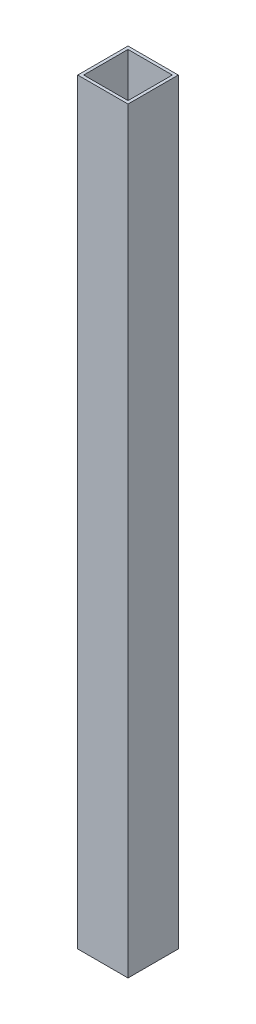
ISO-10303-21;
HEADER;
FILE_DESCRIPTION(('STEP AP214'),'2;1');
FILE_NAME('part.step','',(''),(''),'','','');
FILE_SCHEMA(('AUTOMOTIVE_DESIGN { 1 0 10303 214 1 1 1 1 }'));
ENDSEC;
DATA;
#1=APPLICATION_CONTEXT('core data for automotive mechanical design processes');
#2=APPLICATION_PROTOCOL_DEFINITION('international standard','automotive_design',2000,#1);
#3=PRODUCT_CONTEXT('',#1,'mechanical');
#4=PRODUCT('Part','Part','',(#3));
#5=PRODUCT_RELATED_PRODUCT_CATEGORY('part','',(#4));
#6=PRODUCT_DEFINITION_FORMATION('','',#4);
#7=PRODUCT_DEFINITION_CONTEXT('part definition',#1,'design');
#8=PRODUCT_DEFINITION('design','',#6,#7);
#9=PRODUCT_DEFINITION_SHAPE('','',#8);
#10=(LENGTH_UNIT() NAMED_UNIT(*) SI_UNIT(.MILLI.,.METRE.));
#11=(NAMED_UNIT(*) PLANE_ANGLE_UNIT() SI_UNIT($,.RADIAN.));
#12=(NAMED_UNIT(*) SI_UNIT($,.STERADIAN.) SOLID_ANGLE_UNIT());
#13=UNCERTAINTY_MEASURE_WITH_UNIT(LENGTH_MEASURE(1.E-05),#10,'distance_accuracy_value','');
#14=(GEOMETRIC_REPRESENTATION_CONTEXT(3) GLOBAL_UNCERTAINTY_ASSIGNED_CONTEXT((#13)) GLOBAL_UNIT_ASSIGNED_CONTEXT((#10,
#11,#12)) REPRESENTATION_CONTEXT('',''));
#15=CARTESIAN_POINT('',(0.,0.,0.));
#16=DIRECTION('',(0.,0.,1.));
#17=DIRECTION('',(1.,0.,0.));
#18=AXIS2_PLACEMENT_3D('',#15,#16,#17);
#19=CARTESIAN_POINT('',(-8.5,256.,-8.5));
#20=DIRECTION('',(0.,0.,-1.));
#21=DIRECTION('',(-1.,0.,0.));
#22=AXIS2_PLACEMENT_3D('',#19,#20,#21);
#23=PLANE('',#22);
#24=DIRECTION('',(1.,0.,0.));
#25=VECTOR('',#24,1.);
#26=CARTESIAN_POINT('',(-8.5,0.,-8.5));
#27=LINE('',#26,#25);
#28=CARTESIAN_POINT('',(-8.5,0.,-8.5));
#29=VERTEX_POINT('',#28);
#30=CARTESIAN_POINT('',(8.49999999999999,0.,-8.5));
#31=VERTEX_POINT('',#30);
#32=EDGE_CURVE('E170',#29,#31,#27,.T.);
#33=ORIENTED_EDGE('',*,*,#32,.F.);
#34=DIRECTION('',(0.,-1.,0.));
#35=VECTOR('',#34,1.);
#36=CARTESIAN_POINT('',(-8.5,256.,-8.5));
#37=LINE('',#36,#35);
#38=CARTESIAN_POINT('',(-8.5,256.,-8.5));
#39=VERTEX_POINT('',#38);
#40=EDGE_CURVE('E12',#39,#29,#37,.T.);
#41=ORIENTED_EDGE('',*,*,#40,.F.);
#42=DIRECTION('',(1.,0.,0.));
#43=VECTOR('',#42,1.);
#44=CARTESIAN_POINT('',(-8.5,256.,-8.5));
#45=LINE('',#44,#43);
#46=CARTESIAN_POINT('',(8.49999999999999,256.,-8.5));
#47=VERTEX_POINT('',#46);
#48=EDGE_CURVE('E176',#39,#47,#45,.T.);
#49=ORIENTED_EDGE('',*,*,#48,.T.);
#50=DIRECTION('',(0.,-1.,0.));
#51=VECTOR('',#50,1.);
#52=CARTESIAN_POINT('',(8.49999999999999,256.,-8.5));
#53=LINE('',#52,#51);
#54=EDGE_CURVE('E66',#47,#31,#53,.T.);
#55=ORIENTED_EDGE('',*,*,#54,.T.);
#56=EDGE_LOOP('',(#33,#41,#49,#55));
#57=FACE_BOUND('',#56,.T.);
#58=ADVANCED_FACE('F63',(#57),#23,.T.);
#59=CARTESIAN_POINT('',(-8.5,256.,-8.5));
#60=DIRECTION('',(1.,0.,0.));
#61=DIRECTION('',(0.,0.,-1.));
#62=AXIS2_PLACEMENT_3D('',#59,#60,#61);
#63=PLANE('',#62);
#64=DIRECTION('',(0.,0.,1.));
#65=VECTOR('',#64,1.);
#66=CARTESIAN_POINT('',(-8.5,0.,-8.5));
#67=LINE('',#66,#65);
#68=CARTESIAN_POINT('',(-8.5,0.,8.5));
#69=VERTEX_POINT('',#68);
#70=EDGE_CURVE('E181',#29,#69,#67,.T.);
#71=ORIENTED_EDGE('',*,*,#70,.T.);
#72=DIRECTION('',(0.,-1.,0.));
#73=VECTOR('',#72,1.);
#74=CARTESIAN_POINT('',(-8.5,256.,8.5));
#75=LINE('',#74,#73);
#76=CARTESIAN_POINT('',(-8.5,256.,8.5));
#77=VERTEX_POINT('',#76);
#78=EDGE_CURVE('E72',#77,#69,#75,.T.);
#79=ORIENTED_EDGE('',*,*,#78,.F.);
#80=DIRECTION('',(0.,0.,1.));
#81=VECTOR('',#80,1.);
#82=CARTESIAN_POINT('',(-8.5,256.,-8.5));
#83=LINE('',#82,#81);
#84=EDGE_CURVE('E188',#39,#77,#83,.T.);
#85=ORIENTED_EDGE('',*,*,#84,.F.);
#86=ORIENTED_EDGE('',*,*,#40,.T.);
#87=EDGE_LOOP('',(#71,#79,#85,#86));
#88=FACE_BOUND('',#87,.T.);
#89=ADVANCED_FACE('F223',(#88),#63,.F.);
#90=CARTESIAN_POINT('',(-8.5,256.,8.5));
#91=DIRECTION('',(0.,0.,-1.));
#92=DIRECTION('',(-1.,0.,0.));
#93=AXIS2_PLACEMENT_3D('',#90,#91,#92);
#94=PLANE('',#93);
#95=DIRECTION('',(1.,0.,0.));
#96=VECTOR('',#95,1.);
#97=CARTESIAN_POINT('',(-8.5,0.,8.5));
#98=LINE('',#97,#96);
#99=CARTESIAN_POINT('',(8.49999999999999,0.,8.5));
#100=VERTEX_POINT('',#99);
#101=EDGE_CURVE('E198',#69,#100,#98,.T.);
#102=ORIENTED_EDGE('',*,*,#101,.T.);
#103=DIRECTION('',(0.,-1.,0.));
#104=VECTOR('',#103,1.);
#105=CARTESIAN_POINT('',(8.49999999999999,256.,8.5));
#106=LINE('',#105,#104);
#107=CARTESIAN_POINT('',(8.49999999999999,256.,8.5));
#108=VERTEX_POINT('',#107);
#109=EDGE_CURVE('E206',#108,#100,#106,.T.);
#110=ORIENTED_EDGE('',*,*,#109,.F.);
#111=DIRECTION('',(1.,0.,0.));
#112=VECTOR('',#111,1.);
#113=CARTESIAN_POINT('',(-8.5,256.,8.5));
#114=LINE('',#113,#112);
#115=EDGE_CURVE('E185',#77,#108,#114,.T.);
#116=ORIENTED_EDGE('',*,*,#115,.F.);
#117=ORIENTED_EDGE('',*,*,#78,.T.);
#118=EDGE_LOOP('',(#102,#110,#116,#117));
#119=FACE_BOUND('',#118,.T.);
#120=ADVANCED_FACE('F227',(#119),#94,.F.);
#121=CARTESIAN_POINT('',(8.49999999999999,256.,-8.5));
#122=DIRECTION('',(1.,0.,0.));
#123=DIRECTION('',(0.,0.,-1.));
#124=AXIS2_PLACEMENT_3D('',#121,#122,#123);
#125=PLANE('',#124);
#126=DIRECTION('',(0.,0.,1.));
#127=VECTOR('',#126,1.);
#128=CARTESIAN_POINT('',(8.49999999999999,0.,-8.5));
#129=LINE('',#128,#127);
#130=EDGE_CURVE('E194',#31,#100,#129,.T.);
#131=ORIENTED_EDGE('',*,*,#130,.F.);
#132=ORIENTED_EDGE('',*,*,#54,.F.);
#133=DIRECTION('',(0.,0.,1.));
#134=VECTOR('',#133,1.);
#135=CARTESIAN_POINT('',(8.49999999999999,256.,-8.5));
#136=LINE('',#135,#134);
#137=EDGE_CURVE('E180',#47,#108,#136,.T.);
#138=ORIENTED_EDGE('',*,*,#137,.T.);
#139=ORIENTED_EDGE('',*,*,#109,.T.);
#140=EDGE_LOOP('',(#131,#132,#138,#139));
#141=FACE_BOUND('',#140,.T.);
#142=ADVANCED_FACE('F216',(#141),#125,.T.);
#143=CARTESIAN_POINT('',(0.,256.,0.));
#144=DIRECTION('',(0.,-1.,0.));
#145=DIRECTION('',(0.,0.,-1.));
#146=AXIS2_PLACEMENT_3D('',#143,#144,#145);
#147=PLANE('',#146);
#148=DIRECTION('',(0.,0.,1.));
#149=VECTOR('',#148,1.);
#150=CARTESIAN_POINT('',(-7.5,256.,-7.5));
#151=LINE('',#150,#149);
#152=CARTESIAN_POINT('',(-7.5,256.,-7.5));
#153=VERTEX_POINT('',#152);
#154=CARTESIAN_POINT('',(-7.5,256.,7.5));
#155=VERTEX_POINT('',#154);
#156=EDGE_CURVE('E135',#153,#155,#151,.T.);
#157=ORIENTED_EDGE('',*,*,#156,.F.);
#158=DIRECTION('',(1.,0.,0.));
#159=VECTOR('',#158,1.);
#160=CARTESIAN_POINT('',(-7.5,256.,-7.5));
#161=LINE('',#160,#159);
#162=CARTESIAN_POINT('',(7.5,256.,-7.5));
#163=VERTEX_POINT('',#162);
#164=EDGE_CURVE('E131',#153,#163,#161,.T.);
#165=ORIENTED_EDGE('',*,*,#164,.T.);
#166=DIRECTION('',(0.,0.,1.));
#167=VECTOR('',#166,1.);
#168=CARTESIAN_POINT('',(7.5,256.,-7.5));
#169=LINE('',#168,#167);
#170=CARTESIAN_POINT('',(7.5,256.,7.5));
#171=VERTEX_POINT('',#170);
#172=EDGE_CURVE('E138',#163,#171,#169,.T.);
#173=ORIENTED_EDGE('',*,*,#172,.T.);
#174=DIRECTION('',(1.,0.,0.));
#175=VECTOR('',#174,1.);
#176=CARTESIAN_POINT('',(-7.5,256.,7.5));
#177=LINE('',#176,#175);
#178=EDGE_CURVE('E143',#155,#171,#177,.T.);
#179=ORIENTED_EDGE('',*,*,#178,.F.);
#180=EDGE_LOOP('',(#157,#165,#173,#179));
#181=FACE_BOUND('',#180,.T.);
#182=ORIENTED_EDGE('',*,*,#48,.F.);
#183=ORIENTED_EDGE('',*,*,#84,.T.);
#184=ORIENTED_EDGE('',*,*,#115,.T.);
#185=ORIENTED_EDGE('',*,*,#137,.F.);
#186=EDGE_LOOP('',(#182,#183,#184,#185));
#187=FACE_BOUND('',#186,.T.);
#188=ADVANCED_FACE('F145',(#181,#187),#147,.F.);
#189=CARTESIAN_POINT('',(0.,0.,0.));
#190=DIRECTION('',(0.,-1.,0.));
#191=DIRECTION('',(0.,0.,-1.));
#192=AXIS2_PLACEMENT_3D('',#189,#190,#191);
#193=PLANE('',#192);
#194=DIRECTION('',(1.,0.,0.));
#195=VECTOR('',#194,1.);
#196=CARTESIAN_POINT('',(-7.5,0.,-7.5));
#197=LINE('',#196,#195);
#198=CARTESIAN_POINT('',(-7.5,0.,-7.5));
#199=VERTEX_POINT('',#198);
#200=CARTESIAN_POINT('',(7.5,0.,-7.5));
#201=VERTEX_POINT('',#200);
#202=EDGE_CURVE('E88',#199,#201,#197,.T.);
#203=ORIENTED_EDGE('',*,*,#202,.F.);
#204=DIRECTION('',(0.,0.,1.));
#205=VECTOR('',#204,1.);
#206=CARTESIAN_POINT('',(-7.5,0.,-7.5));
#207=LINE('',#206,#205);
#208=CARTESIAN_POINT('',(-7.5,0.,7.5));
#209=VERTEX_POINT('',#208);
#210=EDGE_CURVE('E148',#199,#209,#207,.T.);
#211=ORIENTED_EDGE('',*,*,#210,.T.);
#212=DIRECTION('',(1.,0.,0.));
#213=VECTOR('',#212,1.);
#214=CARTESIAN_POINT('',(-7.5,0.,7.5));
#215=LINE('',#214,#213);
#216=CARTESIAN_POINT('',(7.5,0.,7.5));
#217=VERTEX_POINT('',#216);
#218=EDGE_CURVE('E152',#209,#217,#215,.T.);
#219=ORIENTED_EDGE('',*,*,#218,.T.);
#220=DIRECTION('',(0.,0.,1.));
#221=VECTOR('',#220,1.);
#222=CARTESIAN_POINT('',(7.5,0.,-7.5));
#223=LINE('',#222,#221);
#224=EDGE_CURVE('E161',#201,#217,#223,.T.);
#225=ORIENTED_EDGE('',*,*,#224,.F.);
#226=EDGE_LOOP('',(#203,#211,#219,#225));
#227=FACE_BOUND('',#226,.T.);
#228=ORIENTED_EDGE('',*,*,#32,.T.);
#229=ORIENTED_EDGE('',*,*,#130,.T.);
#230=ORIENTED_EDGE('',*,*,#101,.F.);
#231=ORIENTED_EDGE('',*,*,#70,.F.);
#232=EDGE_LOOP('',(#228,#229,#230,#231));
#233=FACE_BOUND('',#232,.T.);
#234=ADVANCED_FACE('F220',(#227,#233),#193,.T.);
#235=CARTESIAN_POINT('',(-7.5,256.,-7.5));
#236=DIRECTION('',(0.,0.,-1.));
#237=DIRECTION('',(-1.,0.,0.));
#238=AXIS2_PLACEMENT_3D('',#235,#236,#237);
#239=PLANE('',#238);
#240=ORIENTED_EDGE('',*,*,#202,.T.);
#241=DIRECTION('',(0.,-1.,0.));
#242=VECTOR('',#241,1.);
#243=CARTESIAN_POINT('',(7.5,256.,-7.5));
#244=LINE('',#243,#242);
#245=EDGE_CURVE('E128',#163,#201,#244,.T.);
#246=ORIENTED_EDGE('',*,*,#245,.F.);
#247=ORIENTED_EDGE('',*,*,#164,.F.);
#248=DIRECTION('',(0.,-1.,0.));
#249=VECTOR('',#248,1.);
#250=CARTESIAN_POINT('',(-7.5,256.,-7.5));
#251=LINE('',#250,#249);
#252=EDGE_CURVE('E167',#153,#199,#251,.T.);
#253=ORIENTED_EDGE('',*,*,#252,.T.);
#254=EDGE_LOOP('',(#240,#246,#247,#253));
#255=FACE_BOUND('',#254,.T.);
#256=ADVANCED_FACE('F129',(#255),#239,.F.);
#257=CARTESIAN_POINT('',(-7.5,256.,-7.5));
#258=DIRECTION('',(1.,0.,0.));
#259=DIRECTION('',(0.,0.,-1.));
#260=AXIS2_PLACEMENT_3D('',#257,#258,#259);
#261=PLANE('',#260);
#262=ORIENTED_EDGE('',*,*,#210,.F.);
#263=ORIENTED_EDGE('',*,*,#252,.F.);
#264=ORIENTED_EDGE('',*,*,#156,.T.);
#265=DIRECTION('',(0.,-1.,0.));
#266=VECTOR('',#265,1.);
#267=CARTESIAN_POINT('',(-7.5,256.,7.5));
#268=LINE('',#267,#266);
#269=EDGE_CURVE('E171',#155,#209,#268,.T.);
#270=ORIENTED_EDGE('',*,*,#269,.T.);
#271=EDGE_LOOP('',(#262,#263,#264,#270));
#272=FACE_BOUND('',#271,.T.);
#273=ADVANCED_FACE('F271',(#272),#261,.T.);
#274=CARTESIAN_POINT('',(-7.5,256.,7.5));
#275=DIRECTION('',(0.,0.,-1.));
#276=DIRECTION('',(-1.,0.,0.));
#277=AXIS2_PLACEMENT_3D('',#274,#275,#276);
#278=PLANE('',#277);
#279=ORIENTED_EDGE('',*,*,#218,.F.);
#280=ORIENTED_EDGE('',*,*,#269,.F.);
#281=ORIENTED_EDGE('',*,*,#178,.T.);
#282=DIRECTION('',(0.,-1.,0.));
#283=VECTOR('',#282,1.);
#284=CARTESIAN_POINT('',(7.5,256.,7.5));
#285=LINE('',#284,#283);
#286=EDGE_CURVE('E80',#171,#217,#285,.T.);
#287=ORIENTED_EDGE('',*,*,#286,.T.);
#288=EDGE_LOOP('',(#279,#280,#281,#287));
#289=FACE_BOUND('',#288,.T.);
#290=ADVANCED_FACE('F279',(#289),#278,.T.);
#291=CARTESIAN_POINT('',(7.5,256.,-7.5));
#292=DIRECTION('',(1.,0.,0.));
#293=DIRECTION('',(0.,0.,-1.));
#294=AXIS2_PLACEMENT_3D('',#291,#292,#293);
#295=PLANE('',#294);
#296=ORIENTED_EDGE('',*,*,#224,.T.);
#297=ORIENTED_EDGE('',*,*,#286,.F.);
#298=ORIENTED_EDGE('',*,*,#172,.F.);
#299=ORIENTED_EDGE('',*,*,#245,.T.);
#300=EDGE_LOOP('',(#296,#297,#298,#299));
#301=FACE_BOUND('',#300,.T.);
#302=ADVANCED_FACE('F139',(#301),#295,.F.);
#303=CLOSED_SHELL('',(#58,#89,#120,#142,#188,#234,#256,#273,#290,#302));
#304=MANIFOLD_SOLID_BREP('B2',#303);
#305=ADVANCED_BREP_SHAPE_REPRESENTATION('',(#18,#304),#14);
#306=SHAPE_DEFINITION_REPRESENTATION(#9,#305);
ENDSEC;
END-ISO-10303-21;
